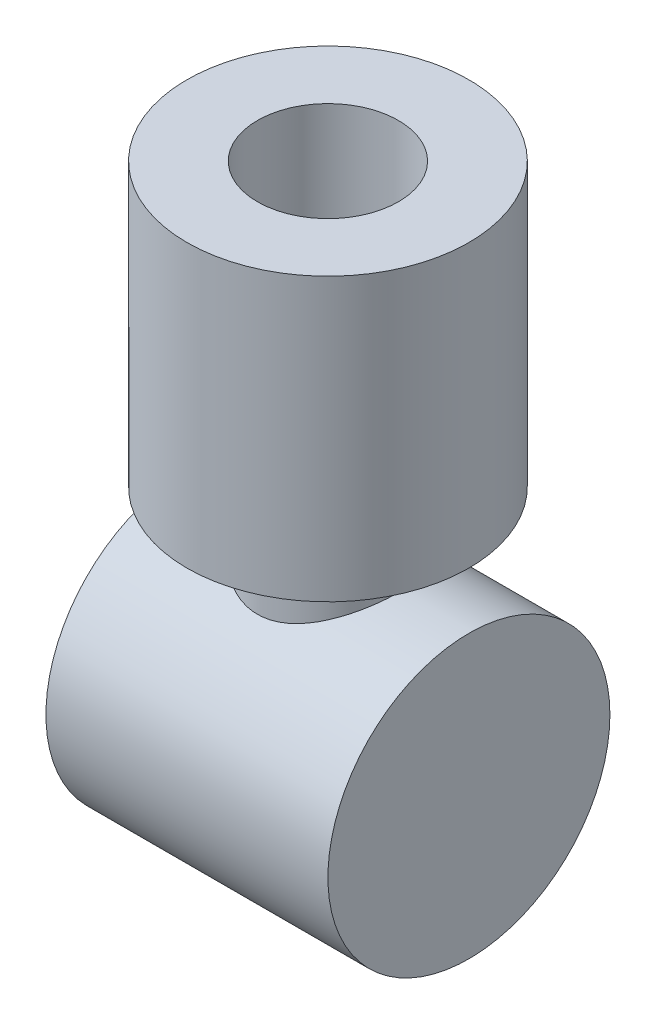
ISO-10303-21;
HEADER;
FILE_DESCRIPTION(('STEP AP214'),'2;1');
FILE_NAME('part.step','',(''),(''),'','','');
FILE_SCHEMA(('AUTOMOTIVE_DESIGN { 1 0 10303 214 1 1 1 1 }'));
ENDSEC;
DATA;
#1=APPLICATION_CONTEXT('core data for automotive mechanical design processes');
#2=APPLICATION_PROTOCOL_DEFINITION('international standard','automotive_design',2000,#1);
#3=PRODUCT_CONTEXT('',#1,'mechanical');
#4=PRODUCT('Part','Part','',(#3));
#5=PRODUCT_RELATED_PRODUCT_CATEGORY('part','',(#4));
#6=PRODUCT_DEFINITION_FORMATION('','',#4);
#7=PRODUCT_DEFINITION_CONTEXT('part definition',#1,'design');
#8=PRODUCT_DEFINITION('design','',#6,#7);
#9=PRODUCT_DEFINITION_SHAPE('','',#8);
#10=(LENGTH_UNIT() NAMED_UNIT(*) SI_UNIT(.MILLI.,.METRE.));
#11=(NAMED_UNIT(*) PLANE_ANGLE_UNIT() SI_UNIT($,.RADIAN.));
#12=(NAMED_UNIT(*) SI_UNIT($,.STERADIAN.) SOLID_ANGLE_UNIT());
#13=UNCERTAINTY_MEASURE_WITH_UNIT(LENGTH_MEASURE(1.E-05),#10,'distance_accuracy_value','');
#14=(GEOMETRIC_REPRESENTATION_CONTEXT(3) GLOBAL_UNCERTAINTY_ASSIGNED_CONTEXT((#13)) GLOBAL_UNIT_ASSIGNED_CONTEXT((#10,
#11,#12)) REPRESENTATION_CONTEXT('',''));
#15=CARTESIAN_POINT('',(0.,0.,0.));
#16=DIRECTION('',(0.,0.,1.));
#17=DIRECTION('',(1.,0.,0.));
#18=AXIS2_PLACEMENT_3D('',#15,#16,#17);
#19=CARTESIAN_POINT('',(50.,0.,0.));
#20=DIRECTION('',(-1.,0.,0.));
#21=DIRECTION('',(0.,0.,1.));
#22=AXIS2_PLACEMENT_3D('',#19,#20,#21);
#23=CYLINDRICAL_SURFACE('',#22,50.);
#24=CARTESIAN_POINT('',(50.,0.,0.));
#25=DIRECTION('',(1.,0.,0.));
#26=DIRECTION('',(0.,0.,-1.));
#27=AXIS2_PLACEMENT_3D('',#24,#25,#26);
#28=CIRCLE('',#27,50.);
#29=CARTESIAN_POINT('',(50.,0.,-50.));
#30=VERTEX_POINT('',#29);
#31=EDGE_CURVE('E42',#30,#30,#28,.T.);
#32=ORIENTED_EDGE('',*,*,#31,.F.);
#33=EDGE_LOOP('',(#32));
#34=FACE_BOUND('',#33,.T.);
#35=CARTESIAN_POINT('',(-50.,0.,0.));
#36=DIRECTION('',(1.,0.,0.));
#37=DIRECTION('',(0.,0.,-1.));
#38=AXIS2_PLACEMENT_3D('',#35,#36,#37);
#39=CIRCLE('',#38,50.);
#40=CARTESIAN_POINT('',(-50.,0.,-50.));
#41=VERTEX_POINT('',#40);
#42=EDGE_CURVE('E46',#41,#41,#39,.T.);
#43=ORIENTED_EDGE('',*,*,#42,.T.);
#44=EDGE_LOOP('',(#43));
#45=FACE_BOUND('',#44,.T.);
#46=CARTESIAN_POINT('',(0.,43.3012701892219,-25.));
#47=CARTESIAN_POINT('',(-0.651657728078345,43.3012738974014,-24.9999972492967));
#48=CARTESIAN_POINT('',(-1.30337199528604,43.3160310243838,-24.9744865840936));
#49=CARTESIAN_POINT('',(-2.60177863889863,43.3745117210766,-24.8727781222585));
#50=CARTESIAN_POINT('',(-3.24846853548874,43.4182487761207,-24.7965567281536));
#51=CARTESIAN_POINT('',(-4.53272868796324,43.5331573576326,-24.594261965626));
#52=CARTESIAN_POINT('',(-5.17027999705686,43.6043791614141,-24.4680972258424));
#53=CARTESIAN_POINT('',(-6.43045471544741,43.7716876183493,-24.1675168252073));
#54=CARTESIAN_POINT('',(-7.0530795491345,43.8677718885472,-23.9931057884363));
#55=CARTESIAN_POINT('',(-8.2762885876815,44.0810172919438,-23.599020492088));
#56=CARTESIAN_POINT('',(-8.87697298138665,44.1980627806722,-23.3795936665704));
#57=CARTESIAN_POINT('',(-10.0565840143935,44.450003078188,-22.8969708071432));
#58=CARTESIAN_POINT('',(-10.6355102011031,44.584898258003,-22.6337738633895));
#59=CARTESIAN_POINT('',(-11.7687683585691,44.8687304990091,-22.0657597161742));
#60=CARTESIAN_POINT('',(-12.3231060045315,45.0176642949286,-21.7609521836511));
#61=CARTESIAN_POINT('',(-13.405222067322,45.3258294680467,-21.1115697238676));
#62=CARTESIAN_POINT('',(-13.9329906242587,45.4850646187509,-20.766980187319));
#63=CARTESIAN_POINT('',(-15.0020081204318,45.8233826320238,-20.0100786450758));
#64=CARTESIAN_POINT('',(-15.5407899017115,46.0030202537629,-19.5945268058562));
#65=CARTESIAN_POINT('',(-16.5821820892583,46.365184933611,-18.7214577237365));
#66=CARTESIAN_POINT('',(-17.0847906143755,46.5477121413885,-18.2639383011691));
#67=CARTESIAN_POINT('',(-18.0517317034124,46.9112371384387,-17.3088715339642));
#68=CARTESIAN_POINT('',(-18.5160391270901,47.0922338542696,-16.8112983153376));
#69=CARTESIAN_POINT('',(-19.403358645631,47.4481317438997,-15.778873095701));
#70=CARTESIAN_POINT('',(-19.8263845601862,47.6230349449123,-15.2440336736723));
#71=CARTESIAN_POINT('',(-20.6559103346768,47.9741176674734,-14.101935890209));
#72=CARTESIAN_POINT('',(-21.059348132888,48.1495806286941,-13.4922260925484));
#73=CARTESIAN_POINT('',(-21.8130164090103,48.4839520678333,-12.2363642027715));
#74=CARTESIAN_POINT('',(-22.1632438315922,48.6428595949776,-11.5902100209449));
#75=CARTESIAN_POINT('',(-22.8068723133523,48.9394715219822,-10.2658796175507));
#76=CARTESIAN_POINT('',(-23.1003009240628,49.0771861952305,-9.58771912093295));
#77=CARTESIAN_POINT('',(-23.6271574422266,49.3273633204677,-8.20398216536624));
#78=CARTESIAN_POINT('',(-23.8605917227733,49.4398284545107,-7.49840862763116));
#79=CARTESIAN_POINT('',(-24.2500719399282,49.6290152537626,-6.11654042575088));
#80=CARTESIAN_POINT('',(-24.410441753632,49.7077104710277,-5.44173347042513));
#81=CARTESIAN_POINT('',(-24.6748266692845,49.8380758594528,-4.07858290347345));
#82=CARTESIAN_POINT('',(-24.7788442214104,49.8897472055983,-3.3902398817399));
#83=CARTESIAN_POINT('',(-24.9290995504173,49.9645450119384,-2.00608536322839));
#84=CARTESIAN_POINT('',(-24.9753667718625,49.9876860185287,-1.31027785496801));
#85=CARTESIAN_POINT('',(-25.0095715600164,50.0047839981938,0.0831103975767529));
#86=CARTESIAN_POINT('',(-24.9975126954156,49.9987427567891,0.780691030762018));
#87=CARTESIAN_POINT('',(-24.9188401315975,49.9594597758389,2.11091341143742));
#88=CARTESIAN_POINT('',(-24.8570687182852,49.9286325703957,2.74392012544279));
#89=CARTESIAN_POINT('',(-24.6857933574407,49.8435839162395,4.00180573261866));
#90=CARTESIAN_POINT('',(-24.576292770444,49.789364114565,4.6266851948267));
#91=CARTESIAN_POINT('',(-24.3107512890051,49.6588288150231,5.86411664160768));
#92=CARTESIAN_POINT('',(-24.1547088784611,49.5825125973665,6.47666822390542));
#93=CARTESIAN_POINT('',(-23.7976713405259,49.4095616746076,7.68557846708671));
#94=CARTESIAN_POINT('',(-23.5966745985519,49.3129262397264,8.28193654550032));
#95=CARTESIAN_POINT('',(-23.1485341467428,49.1000532579772,9.46307781020892));
#96=CARTESIAN_POINT('',(-22.9007934938713,48.9835642756784,10.0475888012673));
#97=CARTESIAN_POINT('',(-22.3631542092352,48.7345249487321,11.1932924970822));
#98=CARTESIAN_POINT('',(-22.073255627975,48.6019746233258,11.7544852297725));
#99=CARTESIAN_POINT('',(-21.4533967659483,48.3236126521289,12.8510127622086));
#100=CARTESIAN_POINT('',(-21.1234266116358,48.1777977402037,13.3863411434307));
#101=CARTESIAN_POINT('',(-20.4256190341222,47.8759538475335,14.4287052512528));
#102=CARTESIAN_POINT('',(-20.0577785424352,47.7199240394887,14.9357386800821));
#103=CARTESIAN_POINT('',(-19.2498172622248,47.3857329059287,15.9659829272969));
#104=CARTESIAN_POINT('',(-18.8061507663467,47.2068738780239,16.4861908868765));
#105=CARTESIAN_POINT('',(-17.878545130929,46.845063438937,17.4878151609516));
#106=CARTESIAN_POINT('',(-17.3946036999607,46.6621117953404,17.9692292652126));
#107=CARTESIAN_POINT('',(-16.3884818333071,46.2964642917558,18.8913612335406));
#108=CARTESIAN_POINT('',(-15.8662738391005,46.1137687146198,19.3320492409618));
#109=CARTESIAN_POINT('',(-15.0565544991402,45.843593954014,19.9603840123244));
#110=CARTESIAN_POINT('',(-14.7822362181157,45.7541772399157,20.1643863204588));
#111=CARTESIAN_POINT('',(-14.2249760149928,45.5771884650087,20.5613013775411));
#112=CARTESIAN_POINT('',(-13.942031409767,45.489616992766,20.7542106211332));
#113=CARTESIAN_POINT('',(-13.0443742119748,45.2196491270857,21.3395295271279));
#114=CARTESIAN_POINT('',(-12.415048704098,45.0415831062526,21.7118230929146));
#115=CARTESIAN_POINT('',(-11.1225584877746,44.7026030694781,22.401452093898));
#116=CARTESIAN_POINT('',(-10.4593967999659,44.5416875264198,22.7187924238286));
#117=CARTESIAN_POINT('',(-9.4426682570212,44.3176563216602,23.1510609956445));
#118=CARTESIAN_POINT('',(-9.10016001198919,44.2458813176476,23.2878388705815));
#119=CARTESIAN_POINT('',(-8.40838786333442,44.1087973854835,23.5464514655133));
#120=CARTESIAN_POINT('',(-8.05912571077179,44.043486807495,23.6682900002));
#121=CARTESIAN_POINT('',(-7.00201342033253,43.8582674733307,24.0108330854159));
#122=CARTESIAN_POINT('',(-6.28464457283939,43.749027978065,24.2086472902985));
#123=CARTESIAN_POINT('',(-4.88870901344564,43.5713053774777,24.5269620029075));
#124=CARTESIAN_POINT('',(-4.21156873362961,43.5002796598521,24.6523447935619));
#125=CARTESIAN_POINT('',(-2.8466934406897,43.3894151546965,24.8469575763003));
#126=CARTESIAN_POINT('',(-2.15895902852086,43.3495746047734,24.916190741622));
#127=CARTESIAN_POINT('',(-0.779421212571236,43.3028003096564,24.9973937987513));
#128=CARTESIAN_POINT('',(-0.0876205201857791,43.2958466843241,25.0093982853171));
#129=CARTESIAN_POINT('',(1.29410670579053,43.3150972499872,24.9760435062342));
#130=CARTESIAN_POINT('',(1.98403336273573,43.3412992028496,24.9306881126047));
#131=CARTESIAN_POINT('',(3.2805525639814,43.4210793380396,24.7914377927162));
#132=CARTESIAN_POINT('',(3.88799241923915,43.4713430273842,24.7034064080223));
#133=CARTESIAN_POINT('',(5.09235719600756,43.5955661816634,24.4835158457237));
#134=CARTESIAN_POINT('',(5.6892830434807,43.66952354879,24.3516605481936));
#135=CARTESIAN_POINT('',(6.86915997755549,43.8388445712505,24.0455037172597));
#136=CARTESIAN_POINT('',(7.45210761033612,43.9342134579594,23.8711918097489));
#137=CARTESIAN_POINT('',(8.6007779677829,44.1435654387754,23.4817897713769));
#138=CARTESIAN_POINT('',(9.16649963911454,44.2575496684739,23.2666971526418));
#139=CARTESIAN_POINT('',(10.3036310513174,44.5066624984352,22.7866934178469));
#140=CARTESIAN_POINT('',(10.8741040265233,44.6425228592292,22.5199449130061));
#141=CARTESIAN_POINT('',(11.9909294700445,44.9276158962726,21.9456625079577));
#142=CARTESIAN_POINT('',(12.5372714883265,45.0768542828119,21.6381111642824));
#143=CARTESIAN_POINT('',(13.6034940304572,45.3849587766745,20.9841879069052));
#144=CARTESIAN_POINT('',(14.1233692262792,45.5438268085479,20.6378082212681));
#145=CARTESIAN_POINT('',(15.1345879150036,45.8674857084529,19.9081156666699));
#146=CARTESIAN_POINT('',(15.625929372136,46.0322769977309,19.5248001676595));
#147=CARTESIAN_POINT('',(16.6383010122431,46.3851314469512,18.6723933753344));
#148=CARTESIAN_POINT('',(17.1552571745104,46.573507868278,18.1985814957771));
#149=CARTESIAN_POINT('',(18.1479612677743,46.9482395083491,17.208801457832));
#150=CARTESIAN_POINT('',(18.6237060214299,47.1345945702822,16.6928300549538));
#151=CARTESIAN_POINT('',(19.5313825427206,47.500551032776,15.6210867099589));
#152=CARTESIAN_POINT('',(19.9632988201806,47.6801500315453,15.0653008138923));
#153=CARTESIAN_POINT('',(20.78021650138,48.0279167170745,13.9168654136765));
#154=CARTESIAN_POINT('',(21.1652183667226,48.1960845163019,13.324216272321));
#155=CARTESIAN_POINT('',(21.8948385164209,48.5208655173557,12.0890056860871));
#156=CARTESIAN_POINT('',(22.2381140666933,48.6770536851778,11.445537083859));
#157=CARTESIAN_POINT('',(22.8686774667118,48.9683386405048,10.1270695634352));
#158=CARTESIAN_POINT('',(23.1559634400449,49.1034347211076,9.45206958944888));
#159=CARTESIAN_POINT('',(23.6710809469709,49.3484422850348,8.07584855033877));
#160=CARTESIAN_POINT('',(23.8989549518689,49.4583717521001,7.3746466282172));
#161=CARTESIAN_POINT('',(24.2925476674675,49.6497556882263,5.95123328017071));
#162=CARTESIAN_POINT('',(24.458273748637,49.7312135338177,5.22902435653721));
#163=CARTESIAN_POINT('',(24.7129738270469,49.8569959046632,3.83701251064258));
#164=CARTESIAN_POINT('',(24.8075966684247,49.9040426202125,3.16848428122955));
#165=CARTESIAN_POINT('',(24.9424667472851,49.9712236366136,1.82462999197066));
#166=CARTESIAN_POINT('',(24.9827174357542,49.9913596454803,1.14930436629497));
#167=CARTESIAN_POINT('',(25.0083162364952,50.0041574921416,-0.202439854909054));
#168=CARTESIAN_POINT('',(24.9936807058504,49.996827515296,-0.878858064769201));
#169=CARTESIAN_POINT('',(24.9097358222379,49.954915747023,-2.22742891911758));
#170=CARTESIAN_POINT('',(24.8404279743976,49.9203347058167,-2.89958168052));
#171=CARTESIAN_POINT('',(24.6543998024786,49.8280383988319,-4.19012849545484));
#172=CARTESIAN_POINT('',(24.5411116057829,49.7720011161012,-4.80914210853196));
#173=CARTESIAN_POINT('',(24.2688562352993,49.638325111347,-6.03461366863557));
#174=CARTESIAN_POINT('',(24.109891640303,49.5606876088334,-6.64107232241653));
#175=CARTESIAN_POINT('',(23.747849994662,49.3855777801893,-7.83775931737804));
#176=CARTESIAN_POINT('',(23.5447695147136,49.2881039121362,-8.4279863927927));
#177=CARTESIAN_POINT('',(23.0963397362171,49.0754720301766,-9.58886482620042));
#178=CARTESIAN_POINT('',(22.8509884649227,48.9603131909529,-10.1595152690755));
#179=CARTESIAN_POINT('',(22.308659364884,48.7095065616211,-11.3022392748832));
#180=CARTESIAN_POINT('',(22.0099237661831,48.5731936311759,-11.8733321215653));
#181=CARTESIAN_POINT('',(21.3709751726378,48.2870272685357,-12.9882367601858));
#182=CARTESIAN_POINT('',(21.030761401556,48.1371735829479,-13.5320480412983));
#183=CARTESIAN_POINT('',(20.3110145040853,47.82710328795,-14.5901418631954));
#184=CARTESIAN_POINT('',(19.9314678829649,47.6668831290299,-15.1044141747537));
#185=CARTESIAN_POINT('',(19.135326866118,47.3395085084327,-16.1011229628171));
#186=CARTESIAN_POINT('',(18.7187291259197,47.1723534214926,-16.5835565584941));
#187=CARTESIAN_POINT('',(17.8073460558901,46.8178193567662,-17.5609868614201));
#188=CARTESIAN_POINT('',(17.3089057811131,46.630083800416,-18.0524521311882));
#189=CARTESIAN_POINT('',(16.2724114852239,46.2553556901095,-18.9920498989603));
#190=CARTESIAN_POINT('',(15.7343545615363,46.0683631916544,-19.4401792163128));
#191=CARTESIAN_POINT('',(14.6207785923102,45.7000088573962,-20.2909910624585));
#192=CARTESIAN_POINT('',(14.0452252134736,45.5186524130989,-20.6936309903305));
#193=CARTESIAN_POINT('',(12.859787725171,45.1669568158024,-21.4504110417563));
#194=CARTESIAN_POINT('',(12.2499062502337,44.9966168194902,-21.8045548800276));
#195=CARTESIAN_POINT('',(11.3018607185228,44.7508086460529,-22.3024856266454));
#196=CARTESIAN_POINT('',(10.9750333120999,44.6693211671637,-22.4651334968817));
#197=CARTESIAN_POINT('',(10.3136429723918,44.5114376206163,-22.7763547859923));
#198=CARTESIAN_POINT('',(9.97908184493879,44.4350403802383,-22.9249314500231));
#199=CARTESIAN_POINT('',(8.96426144522224,44.2145039056118,-23.3490772961765));
#200=CARTESIAN_POINT('',(8.27288359513331,44.0790247669708,-23.6030526309905));
#201=CARTESIAN_POINT('',(6.8679429361277,43.8370978970742,-24.0493909122374));
#202=CARTESIAN_POINT('',(6.15445136020555,43.7305659487763,-24.2419328799137));
#203=CARTESIAN_POINT('',(4.70954394909074,43.5507401419656,-24.5635340961408));
#204=CARTESIAN_POINT('',(3.97814102285207,43.4774230473757,-24.6926377295426));
#205=CARTESIAN_POINT('',(2.70500982979901,43.3823768905292,-24.8591156657607));
#206=CARTESIAN_POINT('',(2.16587885060814,43.3520358806036,-24.91189663269));
#207=CARTESIAN_POINT('',(1.08451176835221,43.3114803138654,-24.9823411189456));
#208=CARTESIAN_POINT('',(0.542275459994336,43.301267103469,-25.0000022889913));
#209=CARTESIAN_POINT('',(0.,43.3012701892219,-25.));
#210=B_SPLINE_CURVE_WITH_KNOTS('',3,(#46,#47,#48,#49,#50,#51,#52,#53,#54,#55,#56,#57,#58,#59,
#60,#61,#62,#63,#64,#65,#66,#67,#68,#69,#70,#71,#72,#73,#74,#75,#76,#77,#78,#79,#80,#81,#82,#83,
#84,#85,#86,#87,#88,#89,#90,#91,#92,#93,#94,#95,#96,#97,#98,#99,#100,#101,#102,#103,#104,#105,
#106,#107,#108,#109,#110,#111,#112,#113,#114,#115,#116,#117,#118,#119,#120,#121,#122,#123,#124,
#125,#126,#127,#128,#129,#130,#131,#132,#133,#134,#135,#136,#137,#138,#139,#140,#141,#142,#143,
#144,#145,#146,#147,#148,#149,#150,#151,#152,#153,#154,#155,#156,#157,#158,#159,#160,#161,#162,
#163,#164,#165,#166,#167,#168,#169,#170,#171,#172,#173,#174,#175,#176,#177,#178,#179,#180,#181,
#182,#183,#184,#185,#186,#187,#188,#189,#190,#191,#192,#193,#194,#195,#196,#197,#198,#199,#200,
#201,#202,#203,#204,#205,#206,#207,#208,#209),.UNSPECIFIED.,.T.,.F.,(4,2,2,2,2,2,2,2,2,2,2,2,2,
2,2,2,2,2,2,2,2,2,2,2,2,2,2,2,2,2,2,2,2,2,2,2,2,2,2,2,2,2,2,2,2,2,2,2,2,2,2,2,2,2,2,2,2,2,2,2,2,
2,2,2,2,2,2,2,2,2,2,2,2,2,2,2,2,2,2,2,2,4),(0.,1.95441192278272,3.90973393836879,
5.86864987236744,7.8273781225633,9.77561538455969,11.723893149394,13.6717188730885,
15.620262192923,17.7292201070748,19.8382876161037,21.9487286473746,24.0584607311283,
26.3111473362998,28.5639632414418,30.8156836143288,33.067164691916,35.1584826548101,
37.2497096806103,39.339870037992,41.4299025102114,43.3379272290007,45.2458176284876,
47.153770184371,49.0617912774175,50.9960675392925,52.9303414839626,54.8650930001226,
56.8000014052271,58.917848189163,61.0358155497571,63.1553234931732,64.2151556831173,
65.2753209551759,67.5299925667647,69.7844632493247,70.9112804180446,72.0378092573376,
74.2902273803598,76.3642610710997,78.4381775418091,80.5108401701136,82.5833628929462,
84.4287799170669,86.2740335954545,88.1197386074929,89.9655562551281,91.8963352398348,
93.8279423204728,95.7599367269954,97.6920688048029,99.8679420645494,102.043982932003,
104.220790212283,106.39757607266,108.632125578475,110.866749959239,113.099772486652,
115.332530103652,117.360339064742,119.388019315274,121.415095328543,123.442115538416,
125.335316614567,127.228410825634,129.121652247157,131.014982048795,132.989197931268,
134.9634507656,136.938383204219,138.913494094206,141.085252835438,143.257170852589,
145.431106304714,147.604875143848,148.726679825932,149.848225159809,152.091379766987,
154.327936660809,156.562926503801,158.1891770497,159.815536377274),.UNSPECIFIED.);
#211=CARTESIAN_POINT('',(0.,43.3012701892219,-25.));
#212=VERTEX_POINT('',#211);
#213=EDGE_CURVE('E10',#212,#212,#210,.T.);
#214=ORIENTED_EDGE('',*,*,#213,.F.);
#215=EDGE_LOOP('',(#214));
#216=FACE_BOUND('',#215,.T.);
#217=ADVANCED_FACE('F31',(#34,#45,#216),#23,.T.);
#218=CARTESIAN_POINT('',(50.,0.,0.));
#219=DIRECTION('',(1.,0.,0.));
#220=DIRECTION('',(0.,0.,-1.));
#221=AXIS2_PLACEMENT_3D('',#218,#219,#220);
#222=PLANE('',#221);
#223=ORIENTED_EDGE('',*,*,#31,.T.);
#224=EDGE_LOOP('',(#223));
#225=FACE_BOUND('',#224,.T.);
#226=ADVANCED_FACE('F96',(#225),#222,.T.);
#227=CARTESIAN_POINT('',(-50.,0.,0.));
#228=DIRECTION('',(1.,0.,0.));
#229=DIRECTION('',(0.,0.,-1.));
#230=AXIS2_PLACEMENT_3D('',#227,#228,#229);
#231=PLANE('',#230);
#232=ORIENTED_EDGE('',*,*,#42,.F.);
#233=EDGE_LOOP('',(#232));
#234=FACE_BOUND('',#233,.T.);
#235=ADVANCED_FACE('F101',(#234),#231,.F.);
#236=CARTESIAN_POINT('',(0.,70.,0.));
#237=DIRECTION('',(0.,-1.,0.));
#238=DIRECTION('',(0.,0.,-1.));
#239=AXIS2_PLACEMENT_3D('',#236,#237,#238);
#240=CYLINDRICAL_SURFACE('',#239,25.);
#241=CARTESIAN_POINT('',(0.,70.,0.));
#242=DIRECTION('',(0.,1.,0.));
#243=DIRECTION('',(0.,0.,1.));
#244=AXIS2_PLACEMENT_3D('',#241,#242,#243);
#245=CIRCLE('',#244,25.);
#246=CARTESIAN_POINT('',(0.,70.,25.));
#247=VERTEX_POINT('',#246);
#248=EDGE_CURVE('E51',#247,#247,#245,.T.);
#249=ORIENTED_EDGE('',*,*,#248,.F.);
#250=EDGE_LOOP('',(#249));
#251=FACE_BOUND('',#250,.T.);
#252=ORIENTED_EDGE('',*,*,#213,.T.);
#253=EDGE_LOOP('',(#252));
#254=FACE_BOUND('',#253,.T.);
#255=ADVANCED_FACE('F86',(#251,#254),#240,.T.);
#256=CARTESIAN_POINT('',(0.,170.,0.));
#257=DIRECTION('',(0.,-1.,0.));
#258=DIRECTION('',(0.,0.,-1.));
#259=AXIS2_PLACEMENT_3D('',#256,#257,#258);
#260=CYLINDRICAL_SURFACE('',#259,50.);
#261=CARTESIAN_POINT('',(0.,170.,0.));
#262=DIRECTION('',(0.,1.,0.));
#263=DIRECTION('',(0.,0.,1.));
#264=AXIS2_PLACEMENT_3D('',#261,#262,#263);
#265=CIRCLE('',#264,50.);
#266=CARTESIAN_POINT('',(0.,170.,50.));
#267=VERTEX_POINT('',#266);
#268=EDGE_CURVE('E55',#267,#267,#265,.T.);
#269=ORIENTED_EDGE('',*,*,#268,.F.);
#270=EDGE_LOOP('',(#269));
#271=FACE_BOUND('',#270,.T.);
#272=CARTESIAN_POINT('',(0.,70.,0.));
#273=DIRECTION('',(0.,1.,0.));
#274=DIRECTION('',(0.,0.,1.));
#275=AXIS2_PLACEMENT_3D('',#272,#273,#274);
#276=CIRCLE('',#275,50.);
#277=CARTESIAN_POINT('',(0.,70.,50.));
#278=VERTEX_POINT('',#277);
#279=EDGE_CURVE('E56',#278,#278,#276,.T.);
#280=ORIENTED_EDGE('',*,*,#279,.T.);
#281=EDGE_LOOP('',(#280));
#282=FACE_BOUND('',#281,.T.);
#283=ADVANCED_FACE('F80',(#271,#282),#260,.T.);
#284=CARTESIAN_POINT('',(0.,170.,0.));
#285=DIRECTION('',(0.,1.,0.));
#286=DIRECTION('',(0.,0.,1.));
#287=AXIS2_PLACEMENT_3D('',#284,#285,#286);
#288=PLANE('',#287);
#289=CARTESIAN_POINT('',(0.,170.,0.));
#290=DIRECTION('',(0.,1.,0.));
#291=DIRECTION('',(0.,0.,1.));
#292=AXIS2_PLACEMENT_3D('',#289,#290,#291);
#293=CIRCLE('',#292,25.);
#294=CARTESIAN_POINT('',(0.,170.,25.));
#295=VERTEX_POINT('',#294);
#296=EDGE_CURVE('E62',#295,#295,#293,.T.);
#297=ORIENTED_EDGE('',*,*,#296,.F.);
#298=EDGE_LOOP('',(#297));
#299=FACE_BOUND('',#298,.T.);
#300=ORIENTED_EDGE('',*,*,#268,.T.);
#301=EDGE_LOOP('',(#300));
#302=FACE_BOUND('',#301,.T.);
#303=ADVANCED_FACE('F77',(#299,#302),#288,.T.);
#304=CARTESIAN_POINT('',(0.,70.,0.));
#305=DIRECTION('',(0.,1.,0.));
#306=DIRECTION('',(0.,0.,1.));
#307=AXIS2_PLACEMENT_3D('',#304,#305,#306);
#308=PLANE('',#307);
#309=ORIENTED_EDGE('',*,*,#248,.T.);
#310=EDGE_LOOP('',(#309));
#311=FACE_BOUND('',#310,.T.);
#312=ORIENTED_EDGE('',*,*,#279,.F.);
#313=EDGE_LOOP('',(#312));
#314=FACE_BOUND('',#313,.T.);
#315=ADVANCED_FACE('F73',(#311,#314),#308,.F.);
#316=CARTESIAN_POINT('',(0.,120.,0.));
#317=DIRECTION('',(0.,1.,0.));
#318=DIRECTION('',(0.,0.,1.));
#319=AXIS2_PLACEMENT_3D('',#316,#317,#318);
#320=CYLINDRICAL_SURFACE('',#319,25.);
#321=CARTESIAN_POINT('',(0.,120.,0.));
#322=DIRECTION('',(0.,1.,0.));
#323=DIRECTION('',(0.,0.,1.));
#324=AXIS2_PLACEMENT_3D('',#321,#322,#323);
#325=CIRCLE('',#324,25.);
#326=CARTESIAN_POINT('',(0.,120.,25.));
#327=VERTEX_POINT('',#326);
#328=EDGE_CURVE('E59',#327,#327,#325,.T.);
#329=ORIENTED_EDGE('',*,*,#328,.F.);
#330=EDGE_LOOP('',(#329));
#331=FACE_BOUND('',#330,.T.);
#332=ORIENTED_EDGE('',*,*,#296,.T.);
#333=EDGE_LOOP('',(#332));
#334=FACE_BOUND('',#333,.T.);
#335=ADVANCED_FACE('F70',(#331,#334),#320,.F.);
#336=CARTESIAN_POINT('',(0.,120.,0.));
#337=DIRECTION('',(0.,1.,0.));
#338=DIRECTION('',(0.,0.,1.));
#339=AXIS2_PLACEMENT_3D('',#336,#337,#338);
#340=PLANE('',#339);
#341=ORIENTED_EDGE('',*,*,#328,.T.);
#342=EDGE_LOOP('',(#341));
#343=FACE_BOUND('',#342,.T.);
#344=ADVANCED_FACE('F68',(#343),#340,.T.);
#345=CLOSED_SHELL('',(#217,#226,#235,#255,#283,#303,#315,#335,#344));
#346=MANIFOLD_SOLID_BREP('B2',#345);
#347=ADVANCED_BREP_SHAPE_REPRESENTATION('',(#18,#346),#14);
#348=SHAPE_DEFINITION_REPRESENTATION(#9,#347);
ENDSEC;
END-ISO-10303-21;
